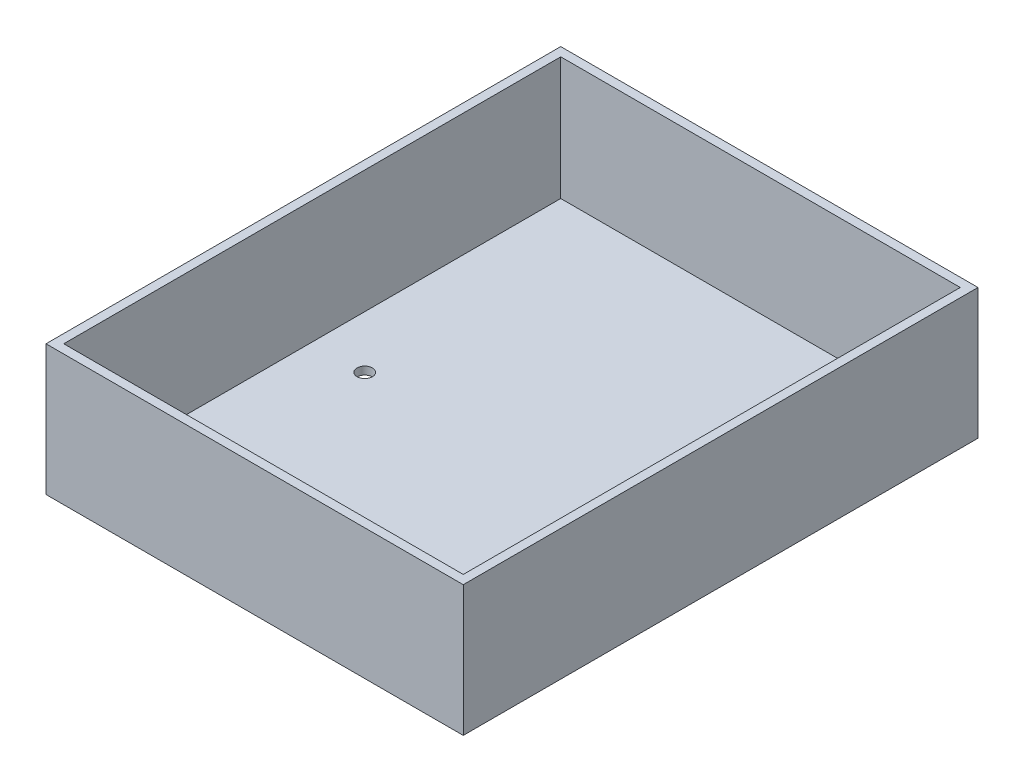
ISO-10303-21;
HEADER;
FILE_DESCRIPTION(('STEP AP214'),'2;1');
FILE_NAME('part.step','',(''),(''),'','','');
FILE_SCHEMA(('AUTOMOTIVE_DESIGN { 1 0 10303 214 1 1 1 1 }'));
ENDSEC;
DATA;
#1=APPLICATION_CONTEXT('core data for automotive mechanical design processes');
#2=APPLICATION_PROTOCOL_DEFINITION('international standard','automotive_design',2000,#1);
#3=PRODUCT_CONTEXT('',#1,'mechanical');
#4=PRODUCT('Part','Part','',(#3));
#5=PRODUCT_RELATED_PRODUCT_CATEGORY('part','',(#4));
#6=PRODUCT_DEFINITION_FORMATION('','',#4);
#7=PRODUCT_DEFINITION_CONTEXT('part definition',#1,'design');
#8=PRODUCT_DEFINITION('design','',#6,#7);
#9=PRODUCT_DEFINITION_SHAPE('','',#8);
#10=(LENGTH_UNIT() NAMED_UNIT(*) SI_UNIT(.MILLI.,.METRE.));
#11=(NAMED_UNIT(*) PLANE_ANGLE_UNIT() SI_UNIT($,.RADIAN.));
#12=(NAMED_UNIT(*) SI_UNIT($,.STERADIAN.) SOLID_ANGLE_UNIT());
#13=UNCERTAINTY_MEASURE_WITH_UNIT(LENGTH_MEASURE(1.E-05),#10,'distance_accuracy_value','');
#14=(GEOMETRIC_REPRESENTATION_CONTEXT(3) GLOBAL_UNCERTAINTY_ASSIGNED_CONTEXT((#13)) GLOBAL_UNIT_ASSIGNED_CONTEXT((#10,
#11,#12)) REPRESENTATION_CONTEXT('',''));
#15=CARTESIAN_POINT('',(0.,0.,0.));
#16=DIRECTION('',(0.,0.,1.));
#17=DIRECTION('',(1.,0.,0.));
#18=AXIS2_PLACEMENT_3D('',#15,#16,#17);
#19=CARTESIAN_POINT('',(30.6,19.15,-37.75));
#20=DIRECTION('',(-1.,0.,0.));
#21=DIRECTION('',(0.,0.,1.));
#22=AXIS2_PLACEMENT_3D('',#19,#20,#21);
#23=PLANE('',#22);
#24=DIRECTION('',(0.,0.,-1.));
#25=VECTOR('',#24,1.);
#26=CARTESIAN_POINT('',(30.6,0.,-37.75));
#27=LINE('',#26,#25);
#28=CARTESIAN_POINT('',(30.6,0.,37.75));
#29=VERTEX_POINT('',#28);
#30=CARTESIAN_POINT('',(30.6,0.,-37.75));
#31=VERTEX_POINT('',#30);
#32=EDGE_CURVE('E144',#29,#31,#27,.T.);
#33=ORIENTED_EDGE('',*,*,#32,.T.);
#34=DIRECTION('',(0.,-1.,0.));
#35=VECTOR('',#34,1.);
#36=CARTESIAN_POINT('',(30.6,19.15,-37.75));
#37=LINE('',#36,#35);
#38=CARTESIAN_POINT('',(30.6,19.15,-37.75));
#39=VERTEX_POINT('',#38);
#40=EDGE_CURVE('E11',#39,#31,#37,.T.);
#41=ORIENTED_EDGE('',*,*,#40,.F.);
#42=DIRECTION('',(0.,0.,-1.));
#43=VECTOR('',#42,1.);
#44=CARTESIAN_POINT('',(30.6,19.15,-37.75));
#45=LINE('',#44,#43);
#46=CARTESIAN_POINT('',(30.6,19.15,37.75));
#47=VERTEX_POINT('',#46);
#48=EDGE_CURVE('E148',#47,#39,#45,.T.);
#49=ORIENTED_EDGE('',*,*,#48,.F.);
#50=DIRECTION('',(0.,-1.,0.));
#51=VECTOR('',#50,1.);
#52=CARTESIAN_POINT('',(30.6,19.15,37.75));
#53=LINE('',#52,#51);
#54=EDGE_CURVE('E154',#47,#29,#53,.T.);
#55=ORIENTED_EDGE('',*,*,#54,.T.);
#56=EDGE_LOOP('',(#33,#41,#49,#55));
#57=FACE_BOUND('',#56,.T.);
#58=ADVANCED_FACE('F33',(#57),#23,.F.);
#59=CARTESIAN_POINT('',(-30.6,19.15,-37.75));
#60=DIRECTION('',(0.,0.,1.));
#61=DIRECTION('',(1.,0.,0.));
#62=AXIS2_PLACEMENT_3D('',#59,#60,#61);
#63=PLANE('',#62);
#64=DIRECTION('',(-1.,0.,0.));
#65=VECTOR('',#64,1.);
#66=CARTESIAN_POINT('',(-30.6,0.,-37.75));
#67=LINE('',#66,#65);
#68=CARTESIAN_POINT('',(-30.6,0.,-37.75));
#69=VERTEX_POINT('',#68);
#70=EDGE_CURVE('E157',#31,#69,#67,.T.);
#71=ORIENTED_EDGE('',*,*,#70,.T.);
#72=DIRECTION('',(0.,-1.,0.));
#73=VECTOR('',#72,1.);
#74=CARTESIAN_POINT('',(-30.6,19.15,-37.75));
#75=LINE('',#74,#73);
#76=CARTESIAN_POINT('',(-30.6,19.15,-37.75));
#77=VERTEX_POINT('',#76);
#78=EDGE_CURVE('E40',#77,#69,#75,.T.);
#79=ORIENTED_EDGE('',*,*,#78,.F.);
#80=DIRECTION('',(-1.,0.,0.));
#81=VECTOR('',#80,1.);
#82=CARTESIAN_POINT('',(-30.6,19.15,-37.75));
#83=LINE('',#82,#81);
#84=EDGE_CURVE('E84',#39,#77,#83,.T.);
#85=ORIENTED_EDGE('',*,*,#84,.F.);
#86=ORIENTED_EDGE('',*,*,#40,.T.);
#87=EDGE_LOOP('',(#71,#79,#85,#86));
#88=FACE_BOUND('',#87,.T.);
#89=ADVANCED_FACE('F186',(#88),#63,.F.);
#90=CARTESIAN_POINT('',(-30.6,19.15,-37.75));
#91=DIRECTION('',(1.,0.,0.));
#92=DIRECTION('',(0.,0.,-1.));
#93=AXIS2_PLACEMENT_3D('',#90,#91,#92);
#94=PLANE('',#93);
#95=DIRECTION('',(0.,0.,1.));
#96=VECTOR('',#95,1.);
#97=CARTESIAN_POINT('',(-30.6,0.,-37.75));
#98=LINE('',#97,#96);
#99=CARTESIAN_POINT('',(-30.6,0.,37.75));
#100=VERTEX_POINT('',#99);
#101=EDGE_CURVE('E159',#69,#100,#98,.T.);
#102=ORIENTED_EDGE('',*,*,#101,.T.);
#103=DIRECTION('',(0.,-1.,0.));
#104=VECTOR('',#103,1.);
#105=CARTESIAN_POINT('',(-30.6,19.15,37.75));
#106=LINE('',#105,#104);
#107=CARTESIAN_POINT('',(-30.6,19.15,37.75));
#108=VERTEX_POINT('',#107);
#109=EDGE_CURVE('E163',#108,#100,#106,.T.);
#110=ORIENTED_EDGE('',*,*,#109,.F.);
#111=DIRECTION('',(0.,0.,1.));
#112=VECTOR('',#111,1.);
#113=CARTESIAN_POINT('',(-30.6,19.15,-37.75));
#114=LINE('',#113,#112);
#115=EDGE_CURVE('E151',#77,#108,#114,.T.);
#116=ORIENTED_EDGE('',*,*,#115,.F.);
#117=ORIENTED_EDGE('',*,*,#78,.T.);
#118=EDGE_LOOP('',(#102,#110,#116,#117));
#119=FACE_BOUND('',#118,.T.);
#120=ADVANCED_FACE('F168',(#119),#94,.F.);
#121=CARTESIAN_POINT('',(-30.6,19.15,37.75));
#122=DIRECTION('',(0.,0.,-1.));
#123=DIRECTION('',(-1.,0.,0.));
#124=AXIS2_PLACEMENT_3D('',#121,#122,#123);
#125=PLANE('',#124);
#126=DIRECTION('',(1.,0.,0.));
#127=VECTOR('',#126,1.);
#128=CARTESIAN_POINT('',(-30.6,0.,37.75));
#129=LINE('',#128,#127);
#130=EDGE_CURVE('E77',#100,#29,#129,.T.);
#131=ORIENTED_EDGE('',*,*,#130,.T.);
#132=ORIENTED_EDGE('',*,*,#54,.F.);
#133=DIRECTION('',(1.,0.,0.));
#134=VECTOR('',#133,1.);
#135=CARTESIAN_POINT('',(-30.6,19.15,37.75));
#136=LINE('',#135,#134);
#137=EDGE_CURVE('E56',#108,#47,#136,.T.);
#138=ORIENTED_EDGE('',*,*,#137,.F.);
#139=ORIENTED_EDGE('',*,*,#109,.T.);
#140=EDGE_LOOP('',(#131,#132,#138,#139));
#141=FACE_BOUND('',#140,.T.);
#142=ADVANCED_FACE('F176',(#141),#125,.F.);
#143=CARTESIAN_POINT('',(0.,19.15,0.));
#144=DIRECTION('',(0.,1.,0.));
#145=DIRECTION('',(0.,0.,1.));
#146=AXIS2_PLACEMENT_3D('',#143,#144,#145);
#147=PLANE('',#146);
#148=DIRECTION('',(0.,0.,-1.));
#149=VECTOR('',#148,1.);
#150=CARTESIAN_POINT('',(29.3,19.15,-36.4496745753059));
#151=LINE('',#150,#149);
#152=CARTESIAN_POINT('',(29.3,19.15,36.4496745753059));
#153=VERTEX_POINT('',#152);
#154=CARTESIAN_POINT('',(29.3,19.15,-36.4496745753059));
#155=VERTEX_POINT('',#154);
#156=EDGE_CURVE('E47',#153,#155,#151,.T.);
#157=ORIENTED_EDGE('',*,*,#156,.F.);
#158=DIRECTION('',(1.,0.,0.));
#159=VECTOR('',#158,1.);
#160=CARTESIAN_POINT('',(-29.3,19.15,36.4496745753059));
#161=LINE('',#160,#159);
#162=CARTESIAN_POINT('',(-29.3,19.15,36.4496745753059));
#163=VERTEX_POINT('',#162);
#164=EDGE_CURVE('E126',#163,#153,#161,.T.);
#165=ORIENTED_EDGE('',*,*,#164,.F.);
#166=DIRECTION('',(0.,0.,1.));
#167=VECTOR('',#166,1.);
#168=CARTESIAN_POINT('',(-29.3,19.15,-36.4496745753059));
#169=LINE('',#168,#167);
#170=CARTESIAN_POINT('',(-29.3,19.15,-36.4496745753059));
#171=VERTEX_POINT('',#170);
#172=EDGE_CURVE('E129',#171,#163,#169,.T.);
#173=ORIENTED_EDGE('',*,*,#172,.F.);
#174=DIRECTION('',(-1.,0.,0.));
#175=VECTOR('',#174,1.);
#176=CARTESIAN_POINT('',(-29.3,19.15,-36.4496745753059));
#177=LINE('',#176,#175);
#178=EDGE_CURVE('E138',#155,#171,#177,.T.);
#179=ORIENTED_EDGE('',*,*,#178,.F.);
#180=EDGE_LOOP('',(#157,#165,#173,#179));
#181=FACE_BOUND('',#180,.T.);
#182=ORIENTED_EDGE('',*,*,#48,.T.);
#183=ORIENTED_EDGE('',*,*,#84,.T.);
#184=ORIENTED_EDGE('',*,*,#115,.T.);
#185=ORIENTED_EDGE('',*,*,#137,.T.);
#186=EDGE_LOOP('',(#182,#183,#184,#185));
#187=FACE_BOUND('',#186,.T.);
#188=ADVANCED_FACE('F178',(#181,#187),#147,.T.);
#189=CARTESIAN_POINT('',(0.,0.,0.));
#190=DIRECTION('',(0.,1.,0.));
#191=DIRECTION('',(0.,0.,1.));
#192=AXIS2_PLACEMENT_3D('',#189,#190,#191);
#193=PLANE('',#192);
#194=CARTESIAN_POINT('',(-21.6,0.,0.));
#195=DIRECTION('',(0.,1.,0.));
#196=DIRECTION('',(0.,0.,1.));
#197=AXIS2_PLACEMENT_3D('',#194,#195,#196);
#198=CIRCLE('',#197,1.125);
#199=CARTESIAN_POINT('',(-21.6,0.,1.125));
#200=VERTEX_POINT('',#199);
#201=EDGE_CURVE('E132',#200,#200,#198,.T.);
#202=ORIENTED_EDGE('',*,*,#201,.T.);
#203=EDGE_LOOP('',(#202));
#204=FACE_BOUND('',#203,.T.);
#205=CARTESIAN_POINT('',(21.6,0.,0.));
#206=DIRECTION('',(0.,1.,0.));
#207=DIRECTION('',(0.,0.,1.));
#208=AXIS2_PLACEMENT_3D('',#205,#206,#207);
#209=CIRCLE('',#208,1.125);
#210=CARTESIAN_POINT('',(21.6,0.,1.125));
#211=VERTEX_POINT('',#210);
#212=EDGE_CURVE('E292',#211,#211,#209,.T.);
#213=ORIENTED_EDGE('',*,*,#212,.T.);
#214=EDGE_LOOP('',(#213));
#215=FACE_BOUND('',#214,.T.);
#216=ORIENTED_EDGE('',*,*,#32,.F.);
#217=ORIENTED_EDGE('',*,*,#130,.F.);
#218=ORIENTED_EDGE('',*,*,#101,.F.);
#219=ORIENTED_EDGE('',*,*,#70,.F.);
#220=EDGE_LOOP('',(#216,#217,#218,#219));
#221=FACE_BOUND('',#220,.T.);
#222=ADVANCED_FACE('F172',(#204,#215,#221),#193,.F.);
#223=CARTESIAN_POINT('',(29.3,1.15,-36.4496745753059));
#224=DIRECTION('',(1.,0.,0.));
#225=DIRECTION('',(0.,0.,-1.));
#226=AXIS2_PLACEMENT_3D('',#223,#224,#225);
#227=PLANE('',#226);
#228=ORIENTED_EDGE('',*,*,#156,.T.);
#229=DIRECTION('',(0.,1.,0.));
#230=VECTOR('',#229,1.);
#231=CARTESIAN_POINT('',(29.3,1.15,-36.4496745753059));
#232=LINE('',#231,#230);
#233=CARTESIAN_POINT('',(29.3,1.15,-36.4496745753059));
#234=VERTEX_POINT('',#233);
#235=EDGE_CURVE('E104',#234,#155,#232,.T.);
#236=ORIENTED_EDGE('',*,*,#235,.F.);
#237=DIRECTION('',(0.,0.,-1.));
#238=VECTOR('',#237,1.);
#239=CARTESIAN_POINT('',(29.3,1.15,-36.4496745753059));
#240=LINE('',#239,#238);
#241=CARTESIAN_POINT('',(29.3,1.15,36.4496745753059));
#242=VERTEX_POINT('',#241);
#243=EDGE_CURVE('E108',#242,#234,#240,.T.);
#244=ORIENTED_EDGE('',*,*,#243,.F.);
#245=DIRECTION('',(0.,1.,0.));
#246=VECTOR('',#245,1.);
#247=CARTESIAN_POINT('',(29.3,1.15,36.4496745753059));
#248=LINE('',#247,#246);
#249=EDGE_CURVE('E142',#242,#153,#248,.T.);
#250=ORIENTED_EDGE('',*,*,#249,.T.);
#251=EDGE_LOOP('',(#228,#236,#244,#250));
#252=FACE_BOUND('',#251,.T.);
#253=ADVANCED_FACE('F106',(#252),#227,.F.);
#254=CARTESIAN_POINT('',(-29.3,1.15,36.4496745753059));
#255=DIRECTION('',(0.,0.,1.));
#256=DIRECTION('',(1.,0.,0.));
#257=AXIS2_PLACEMENT_3D('',#254,#255,#256);
#258=PLANE('',#257);
#259=ORIENTED_EDGE('',*,*,#164,.T.);
#260=ORIENTED_EDGE('',*,*,#249,.F.);
#261=DIRECTION('',(1.,0.,0.));
#262=VECTOR('',#261,1.);
#263=CARTESIAN_POINT('',(-29.3,1.15,36.4496745753059));
#264=LINE('',#263,#262);
#265=CARTESIAN_POINT('',(-29.3,1.15,36.4496745753059));
#266=VERTEX_POINT('',#265);
#267=EDGE_CURVE('E114',#266,#242,#264,.T.);
#268=ORIENTED_EDGE('',*,*,#267,.F.);
#269=DIRECTION('',(0.,1.,0.));
#270=VECTOR('',#269,1.);
#271=CARTESIAN_POINT('',(-29.3,1.15,36.4496745753059));
#272=LINE('',#271,#270);
#273=EDGE_CURVE('E145',#266,#163,#272,.T.);
#274=ORIENTED_EDGE('',*,*,#273,.T.);
#275=EDGE_LOOP('',(#259,#260,#268,#274));
#276=FACE_BOUND('',#275,.T.);
#277=ADVANCED_FACE('F220',(#276),#258,.F.);
#278=CARTESIAN_POINT('',(-29.3,1.15,-36.4496745753059));
#279=DIRECTION('',(-1.,0.,0.));
#280=DIRECTION('',(0.,0.,1.));
#281=AXIS2_PLACEMENT_3D('',#278,#279,#280);
#282=PLANE('',#281);
#283=ORIENTED_EDGE('',*,*,#172,.T.);
#284=ORIENTED_EDGE('',*,*,#273,.F.);
#285=DIRECTION('',(0.,0.,1.));
#286=VECTOR('',#285,1.);
#287=CARTESIAN_POINT('',(-29.3,1.15,-36.4496745753059));
#288=LINE('',#287,#286);
#289=CARTESIAN_POINT('',(-29.3,1.15,-36.4496745753059));
#290=VERTEX_POINT('',#289);
#291=EDGE_CURVE('E122',#290,#266,#288,.T.);
#292=ORIENTED_EDGE('',*,*,#291,.F.);
#293=DIRECTION('',(0.,1.,0.));
#294=VECTOR('',#293,1.);
#295=CARTESIAN_POINT('',(-29.3,1.15,-36.4496745753059));
#296=LINE('',#295,#294);
#297=EDGE_CURVE('E113',#290,#171,#296,.T.);
#298=ORIENTED_EDGE('',*,*,#297,.T.);
#299=EDGE_LOOP('',(#283,#284,#292,#298));
#300=FACE_BOUND('',#299,.T.);
#301=ADVANCED_FACE('F229',(#300),#282,.F.);
#302=CARTESIAN_POINT('',(-29.3,1.15,-36.4496745753059));
#303=DIRECTION('',(0.,0.,-1.));
#304=DIRECTION('',(-1.,0.,0.));
#305=AXIS2_PLACEMENT_3D('',#302,#303,#304);
#306=PLANE('',#305);
#307=ORIENTED_EDGE('',*,*,#178,.T.);
#308=ORIENTED_EDGE('',*,*,#297,.F.);
#309=DIRECTION('',(-1.,0.,0.));
#310=VECTOR('',#309,1.);
#311=CARTESIAN_POINT('',(-29.3,1.15,-36.4496745753059));
#312=LINE('',#311,#310);
#313=EDGE_CURVE('E117',#234,#290,#312,.T.);
#314=ORIENTED_EDGE('',*,*,#313,.F.);
#315=ORIENTED_EDGE('',*,*,#235,.T.);
#316=EDGE_LOOP('',(#307,#308,#314,#315));
#317=FACE_BOUND('',#316,.T.);
#318=ADVANCED_FACE('F118',(#317),#306,.F.);
#319=CARTESIAN_POINT('',(0.,1.15,0.));
#320=DIRECTION('',(0.,1.,0.));
#321=DIRECTION('',(0.,0.,1.));
#322=AXIS2_PLACEMENT_3D('',#319,#320,#321);
#323=PLANE('',#322);
#324=CARTESIAN_POINT('',(-21.6,1.15,0.));
#325=DIRECTION('',(0.,1.,0.));
#326=DIRECTION('',(0.,0.,1.));
#327=AXIS2_PLACEMENT_3D('',#324,#325,#326);
#328=CIRCLE('',#327,1.125);
#329=CARTESIAN_POINT('',(-21.6,1.15,1.125));
#330=VERTEX_POINT('',#329);
#331=EDGE_CURVE('E289',#330,#330,#328,.T.);
#332=ORIENTED_EDGE('',*,*,#331,.F.);
#333=EDGE_LOOP('',(#332));
#334=FACE_BOUND('',#333,.T.);
#335=CARTESIAN_POINT('',(21.6,1.15,0.));
#336=DIRECTION('',(0.,1.,0.));
#337=DIRECTION('',(0.,0.,1.));
#338=AXIS2_PLACEMENT_3D('',#335,#336,#337);
#339=CIRCLE('',#338,1.125);
#340=CARTESIAN_POINT('',(21.6,1.15,1.125));
#341=VERTEX_POINT('',#340);
#342=EDGE_CURVE('E296',#341,#341,#339,.T.);
#343=ORIENTED_EDGE('',*,*,#342,.F.);
#344=EDGE_LOOP('',(#343));
#345=FACE_BOUND('',#344,.T.);
#346=ORIENTED_EDGE('',*,*,#243,.T.);
#347=ORIENTED_EDGE('',*,*,#313,.T.);
#348=ORIENTED_EDGE('',*,*,#291,.T.);
#349=ORIENTED_EDGE('',*,*,#267,.T.);
#350=EDGE_LOOP('',(#346,#347,#348,#349));
#351=FACE_BOUND('',#350,.T.);
#352=ADVANCED_FACE('F124',(#334,#345,#351),#323,.T.);
#353=CARTESIAN_POINT('',(21.6,-18.85,0.));
#354=DIRECTION('',(0.,1.,0.));
#355=DIRECTION('',(0.,0.,1.));
#356=AXIS2_PLACEMENT_3D('',#353,#354,#355);
#357=CYLINDRICAL_SURFACE('',#356,1.125);
#358=ORIENTED_EDGE('',*,*,#342,.T.);
#359=EDGE_LOOP('',(#358));
#360=FACE_BOUND('',#359,.T.);
#361=ORIENTED_EDGE('',*,*,#212,.F.);
#362=EDGE_LOOP('',(#361));
#363=FACE_BOUND('',#362,.T.);
#364=ADVANCED_FACE('F262',(#360,#363),#357,.F.);
#365=CARTESIAN_POINT('',(-21.6,-18.85,0.));
#366=DIRECTION('',(0.,1.,0.));
#367=DIRECTION('',(0.,0.,1.));
#368=AXIS2_PLACEMENT_3D('',#365,#366,#367);
#369=CYLINDRICAL_SURFACE('',#368,1.125);
#370=ORIENTED_EDGE('',*,*,#331,.T.);
#371=EDGE_LOOP('',(#370));
#372=FACE_BOUND('',#371,.T.);
#373=ORIENTED_EDGE('',*,*,#201,.F.);
#374=EDGE_LOOP('',(#373));
#375=FACE_BOUND('',#374,.T.);
#376=ADVANCED_FACE('F272',(#372,#375),#369,.F.);
#377=CLOSED_SHELL('',(#58,#89,#120,#142,#188,#222,#253,#277,#301,#318,#352,#364,#376));
#378=MANIFOLD_SOLID_BREP('B2',#377);
#379=ADVANCED_BREP_SHAPE_REPRESENTATION('',(#18,#378),#14);
#380=SHAPE_DEFINITION_REPRESENTATION(#9,#379);
ENDSEC;
END-ISO-10303-21;
